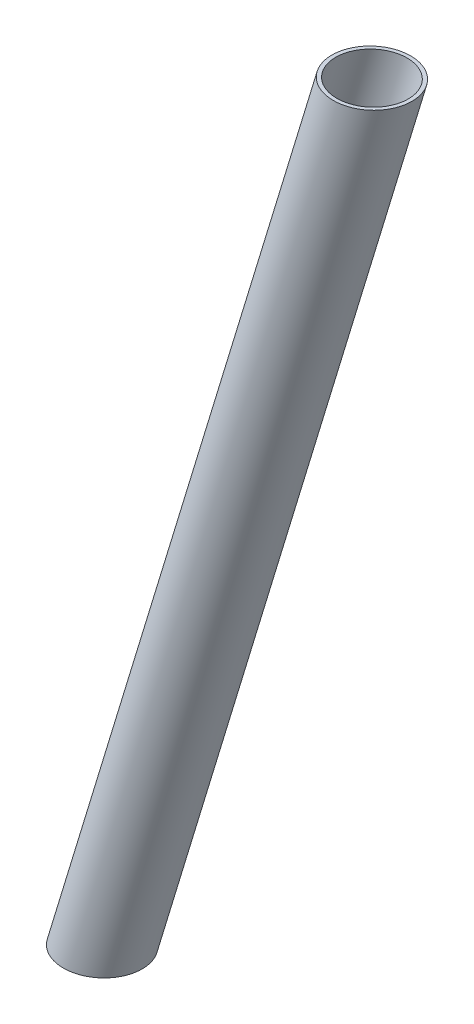
ISO-10303-21;
HEADER;
FILE_DESCRIPTION(('STEP AP214'),'2;1');
FILE_NAME('part.step','',(''),(''),'','','');
FILE_SCHEMA(('AUTOMOTIVE_DESIGN { 1 0 10303 214 1 1 1 1 }'));
ENDSEC;
DATA;
#1=APPLICATION_CONTEXT('core data for automotive mechanical design processes');
#2=APPLICATION_PROTOCOL_DEFINITION('international standard','automotive_design',2000,#1);
#3=PRODUCT_CONTEXT('',#1,'mechanical');
#4=PRODUCT('Part','Part','',(#3));
#5=PRODUCT_RELATED_PRODUCT_CATEGORY('part','',(#4));
#6=PRODUCT_DEFINITION_FORMATION('','',#4);
#7=PRODUCT_DEFINITION_CONTEXT('part definition',#1,'design');
#8=PRODUCT_DEFINITION('design','',#6,#7);
#9=PRODUCT_DEFINITION_SHAPE('','',#8);
#10=(LENGTH_UNIT() NAMED_UNIT(*) SI_UNIT(.MILLI.,.METRE.));
#11=(NAMED_UNIT(*) PLANE_ANGLE_UNIT() SI_UNIT($,.RADIAN.));
#12=(NAMED_UNIT(*) SI_UNIT($,.STERADIAN.) SOLID_ANGLE_UNIT());
#13=UNCERTAINTY_MEASURE_WITH_UNIT(LENGTH_MEASURE(1.E-05),#10,'distance_accuracy_value','');
#14=(GEOMETRIC_REPRESENTATION_CONTEXT(3) GLOBAL_UNCERTAINTY_ASSIGNED_CONTEXT((#13)) GLOBAL_UNIT_ASSIGNED_CONTEXT((#10,
#11,#12)) REPRESENTATION_CONTEXT('',''));
#15=CARTESIAN_POINT('',(0.,0.,0.));
#16=DIRECTION('',(0.,0.,1.));
#17=DIRECTION('',(1.,0.,0.));
#18=AXIS2_PLACEMENT_3D('',#15,#16,#17);
#19=CARTESIAN_POINT('',(7.988329,0.,0.));
#20=DIRECTION('',(0.,1.,0.));
#21=DIRECTION('',(0.,0.,1.));
#22=AXIS2_PLACEMENT_3D('',#19,#20,#21);
#23=PLANE('',#22);
#24=CARTESIAN_POINT('',(7.988329,0.,0.));
#25=DIRECTION('',(0.,1.,0.));
#26=DIRECTION('',(-1.,0.,0.));
#27=AXIS2_PLACEMENT_3D('',#24,#25,#26);
#28=ELLIPSE('',#27,8.,7.72);
#29=CARTESIAN_POINT('',(-0.0116709999999978,0.,0.));
#30=VERTEX_POINT('',#29);
#31=EDGE_CURVE('E11',#30,#30,#28,.T.);
#32=ORIENTED_EDGE('',*,*,#31,.F.);
#33=EDGE_LOOP('',(#32));
#34=FACE_BOUND('',#33,.T.);
#35=CARTESIAN_POINT('',(0.755207153882394,0.,0.0120596784166669));
#36=CARTESIAN_POINT('',(0.7555256312997,0.,0.20397937292244));
#37=CARTESIAN_POINT('',(0.764007149789612,0.,0.395863697663354));
#38=CARTESIAN_POINT('',(0.797221808332363,0.,0.778284051572364));
#39=CARTESIAN_POINT('',(0.821959355103936,0.,0.968819700978407));
#40=CARTESIAN_POINT('',(0.887510384326129,0.,1.34727740379534));
#41=CARTESIAN_POINT('',(0.928338293170894,0.,1.53519695467641));
#42=CARTESIAN_POINT('',(1.02574098246932,0.,1.90698347045138));
#43=CARTESIAN_POINT('',(1.0823216087023,0.,2.09084890348728));
#44=CARTESIAN_POINT('',(1.21065049783151,0.,2.45288505703585));
#45=CARTESIAN_POINT('',(1.28237517245868,0.,2.63106414340688));
#46=CARTESIAN_POINT('',(1.44048583351206,0.,2.98087023738001));
#47=CARTESIAN_POINT('',(1.52687720700094,0.,3.1524948090409));
#48=CARTESIAN_POINT('',(1.71355520760588,0.,3.48787744354628));
#49=CARTESIAN_POINT('',(1.81383366077904,0.,3.65164005813768));
#50=CARTESIAN_POINT('',(2.02758000326452,0.,3.97040314430617));
#51=CARTESIAN_POINT('',(2.14105282258593,0.,4.1254003083566));
#52=CARTESIAN_POINT('',(2.38196369665353,0.,4.42768499397216));
#53=CARTESIAN_POINT('',(2.50957437418934,0.,4.57483492590374));
#54=CARTESIAN_POINT('',(2.77651572869798,0.,4.85818550697875));
#55=CARTESIAN_POINT('',(2.91585067949947,0.,4.99438212763871));
#56=CARTESIAN_POINT('',(3.205139798675,0.,5.25491306583361));
#57=CARTESIAN_POINT('',(3.35509153532152,0.,5.37925008454178));
#58=CARTESIAN_POINT('',(3.66462583687721,0.,5.61541399444382));
#59=CARTESIAN_POINT('',(3.82421199881232,0.,5.72723616817881));
#60=CARTESIAN_POINT('',(4.15679739484265,0.,5.94085875832422));
#61=CARTESIAN_POINT('',(4.33005590317878,0.,6.04225564599698));
#62=CARTESIAN_POINT('',(4.68438639629524,0.,6.23049245246492));
#63=CARTESIAN_POINT('',(4.86546129704479,0.,6.31732687855908));
#64=CARTESIAN_POINT('',(5.23408940004271,0.,6.47590009796413));
#65=CARTESIAN_POINT('',(5.42164220658292,0.,6.54763981145592));
#66=CARTESIAN_POINT('',(5.80195922658219,0.,6.67563853536326));
#67=CARTESIAN_POINT('',(5.99472356958751,0.,6.73189716056689));
#68=CARTESIAN_POINT('',(6.3899281060024,0.,6.83006021634739));
#69=CARTESIAN_POINT('',(6.59248592136504,0.,6.87149159129227));
#70=CARTESIAN_POINT('',(7.00025383826591,0.,6.93737865776443));
#71=CARTESIAN_POINT('',(7.20546279483648,0.,6.96184144341388));
#72=CARTESIAN_POINT('',(7.61730459393639,0.,6.99369378017856));
#73=CARTESIAN_POINT('',(7.82393809531113,0.,7.00107481374277));
#74=CARTESIAN_POINT('',(8.23703017096557,0.,6.99869919793363));
#75=CARTESIAN_POINT('',(8.44348878155139,0.,6.98894879325747));
#76=CARTESIAN_POINT('',(8.85822613328444,0.,6.9520791277149));
#77=CARTESIAN_POINT('',(9.06648014554075,0.,6.92468093820488));
#78=CARTESIAN_POINT('',(9.47985848661278,0.,6.85242381628751));
#79=CARTESIAN_POINT('',(9.68498393388007,0.,6.80757128337449));
#80=CARTESIAN_POINT('',(10.0907870954186,0.,6.70064215324442));
#81=CARTESIAN_POINT('',(10.2914629653866,0.,6.63855855290087));
#82=CARTESIAN_POINT('',(10.6867293058887,0.,6.49756812357686));
#83=CARTESIAN_POINT('',(10.8813221385617,0.,6.41866792018592));
#84=CARTESIAN_POINT('',(11.2621740688192,0.,6.24490361073299));
#85=CARTESIAN_POINT('',(11.4484671580642,0.,6.15011403256319));
#86=CARTESIAN_POINT('',(11.8121680956754,0.,5.94494606189031));
#87=CARTESIAN_POINT('',(11.9895794724473,0.,5.83457392746034));
#88=CARTESIAN_POINT('',(12.3342624928436,0.,5.59887549405114));
#89=CARTESIAN_POINT('',(12.5015308525987,0.,5.47354439057754));
#90=CARTESIAN_POINT('',(12.8244471449908,0.,5.20883552510083));
#91=CARTESIAN_POINT('',(12.9800999275697,0.,5.06946368340809));
#92=CARTESIAN_POINT('',(13.2750235071229,0.,4.78104437360544));
#93=CARTESIAN_POINT('',(13.4145951039271,0.,4.632304457099));
#94=CARTESIAN_POINT('',(13.6803005834816,0.,4.32336656928526));
#95=CARTESIAN_POINT('',(13.8064397795303,0.,4.16317317072338));
#96=CARTESIAN_POINT('',(14.0442799397268,0.,3.83238930691991));
#97=CARTESIAN_POINT('',(14.1559802370348,0.,3.66179836201765));
#98=CARTESIAN_POINT('',(14.3639599138652,0.,3.31146065052711));
#99=CARTESIAN_POINT('',(14.4602396784615,0.,3.13171411271556));
#100=CARTESIAN_POINT('',(14.6336655939008,0.,2.77034757614217));
#101=CARTESIAN_POINT('',(14.7113296777991,0.,2.58897599935017));
#102=CARTESIAN_POINT('',(14.8507439104657,0.,2.22021777992886));
#103=CARTESIAN_POINT('',(14.9124945403791,0.,2.03283131935296));
#104=CARTESIAN_POINT('',(15.0195347806086,0.,1.65343960711848));
#105=CARTESIAN_POINT('',(15.0648265418566,0.,1.46143496248781));
#106=CARTESIAN_POINT('',(15.1385563396876,0.,1.07421631181628));
#107=CARTESIAN_POINT('',(15.1669946236914,0.,0.879002352933637));
#108=CARTESIAN_POINT('',(15.2062505657458,0.,0.491887065225879));
#109=CARTESIAN_POINT('',(15.2175025840886,0.,0.300029660788434));
#110=CARTESIAN_POINT('',(15.2236713449264,0.,-0.084014441967027));
#111=CARTESIAN_POINT('',(15.2185825360441,0.,-0.276201230018577));
#112=CARTESIAN_POINT('',(15.1921062098874,0.,-0.659365282867995));
#113=CARTESIAN_POINT('',(15.1707256509873,0.,-0.850343028956277));
#114=CARTESIAN_POINT('',(15.1118459550985,0.,-1.2298691625468));
#115=CARTESIAN_POINT('',(15.0743408641972,0.,-1.41841662616446));
#116=CARTESIAN_POINT('',(14.9838804036464,0.,-1.79022458430914));
#117=CARTESIAN_POINT('',(14.9310464268368,0.,-1.97351463952805));
#118=CARTESIAN_POINT('',(14.8102347314405,0.,-2.33510634825003));
#119=CARTESIAN_POINT('',(14.7422515144146,0.,-2.51340616402334));
#120=CARTESIAN_POINT('',(14.5917303456759,0.,-2.86367688841697));
#121=CARTESIAN_POINT('',(14.5091974169399,0.,-3.03564995652619));
#122=CARTESIAN_POINT('',(14.3301838604037,0.,-3.37225528221532));
#123=CARTESIAN_POINT('',(14.2336980298332,0.,-3.53688477142016));
#124=CARTESIAN_POINT('',(14.0261975153444,0.,-3.8597779313026));
#125=CARTESIAN_POINT('',(13.9150089112816,0.,-4.01792982408503));
#126=CARTESIAN_POINT('',(13.6799277510007,0.,-4.32457867123584));
#127=CARTESIAN_POINT('',(13.5560305518141,0.,-4.47307206435122));
#128=CARTESIAN_POINT('',(13.2965352056952,0.,-4.75937912144384));
#129=CARTESIAN_POINT('',(13.1609402285742,0.,-4.89719565949476));
#130=CARTESIAN_POINT('',(12.8789616684313,0.,-5.16141382929224));
#131=CARTESIAN_POINT('',(12.7325740661591,0.,-5.28781116905366));
#132=CARTESIAN_POINT('',(12.4258874802239,0.,-5.53174485804931));
#133=CARTESIAN_POINT('',(12.2653149672658,0.,-5.64893738744341));
#134=CARTESIAN_POINT('',(11.9350311090982,0.,-5.86977045328311));
#135=CARTESIAN_POINT('',(11.7653165849368,0.,-5.97340623212895));
#136=CARTESIAN_POINT('',(11.4180094054938,0.,-6.16647951030249));
#137=CARTESIAN_POINT('',(11.2404171750484,0.,-6.25591777409888));
#138=CARTESIAN_POINT('',(10.8785670122149,0.,-6.42010729276175));
#139=CARTESIAN_POINT('',(10.6943088899685,0.,-6.49485812890937));
#140=CARTESIAN_POINT('',(10.3145203636936,0.,-6.6313681730892));
#141=CARTESIAN_POINT('',(10.1188176416349,0.,-6.69264830705555));
#142=CARTESIAN_POINT('',(9.72307896161591,0.,-6.79879505217082));
#143=CARTESIAN_POINT('',(9.52304435614704,0.,-6.84366671025985));
#144=CARTESIAN_POINT('',(9.11986712340145,0.,-6.91679406747401));
#145=CARTESIAN_POINT('',(8.91672312259687,0.,-6.94504219255041));
#146=CARTESIAN_POINT('',(8.50887350705751,0.,-6.98473063349155));
#147=CARTESIAN_POINT('',(8.3041684619439,0.,-6.99617681060679));
#148=CARTESIAN_POINT('',(7.8901063211091,0.,-7.0022833918687));
#149=CARTESIAN_POINT('',(7.68074373813919,0.,-6.99657799877494));
#150=CARTESIAN_POINT('',(7.26331093179351,0.,-6.96762207210909));
#151=CARTESIAN_POINT('',(7.05524027552619,0.,-6.94437777528178));
#152=CARTESIAN_POINT('',(6.64169889683973,0.,-6.88046941352247));
#153=CARTESIAN_POINT('',(6.43622932189401,0.,-6.83979791856954));
#154=CARTESIAN_POINT('',(6.02952972110908,0.,-6.74128563800089));
#155=CARTESIAN_POINT('',(5.8282981029036,0.,-6.68345142896099));
#156=CARTESIAN_POINT('',(5.43102392607119,0.,-6.55080070469891));
#157=CARTESIAN_POINT('',(5.23499356164779,0.,-6.47594764784231));
#158=CARTESIAN_POINT('',(4.85011145780346,0.,-6.30981009498024));
#159=CARTESIAN_POINT('',(4.66125694545141,0.,-6.21853202585869));
#160=CARTESIAN_POINT('',(4.29202791702596,0.,-6.02005530861101));
#161=CARTESIAN_POINT('',(4.11165605525404,0.,-5.9128517203079));
#162=CARTESIAN_POINT('',(3.76094143575391,0.,-5.68327248045909));
#163=CARTESIAN_POINT('',(3.5905945605452,0.,-5.56090312287841));
#164=CARTESIAN_POINT('',(3.26430496809214,0.,-5.30418538172361));
#165=CARTESIAN_POINT('',(3.10815265466531,0.,-5.17010339985061));
#166=CARTESIAN_POINT('',(2.80806621257723,0.,-4.88900586910927));
#167=CARTESIAN_POINT('',(2.66412731509242,0.,-4.74199541434937));
#168=CARTESIAN_POINT('',(2.38954826698956,0.,-4.43594683742597));
#169=CARTESIAN_POINT('',(2.25891252945973,0.,-4.27690475427917));
#170=CARTESIAN_POINT('',(2.01211663031951,0.,-3.94796310787735));
#171=CARTESIAN_POINT('',(1.89595584681933,0.,-3.77806401154872));
#172=CARTESIAN_POINT('',(1.68247423322475,0.,-3.43403643341301));
#173=CARTESIAN_POINT('',(1.584683085129,0.,-3.26019969450334));
#174=CARTESIAN_POINT('',(1.40449186439923,0.,-2.90472976831041));
#175=CARTESIAN_POINT('',(1.32209107015798,0.,-2.72309694705325));
#176=CARTESIAN_POINT('',(1.17349172784371,0.,-2.35358593202038));
#177=CARTESIAN_POINT('',(1.10727251980456,0.,-2.16571605345088));
#178=CARTESIAN_POINT('',(0.991507812873262,0.,-1.78497835399874));
#179=CARTESIAN_POINT('',(0.9419572121216,0.,-1.59211208189303));
#180=CARTESIAN_POINT('',(0.852191660774543,0.,-1.16592349772998));
#181=CARTESIAN_POINT('',(0.815513978410206,0.,-0.931847647292858));
#182=CARTESIAN_POINT('',(0.766825639676092,0.,-0.461143362217406));
#183=CARTESIAN_POINT('',(0.754814574667426,0.,-0.224514969930985));
#184=CARTESIAN_POINT('',(0.755207153882394,0.,0.0120596784166669));
#185=B_SPLINE_CURVE_WITH_KNOTS('',3,(#35,#36,#37,#38,#39,#40,#41,#42,#43,#44,#45,#46,#47,#48,
#49,#50,#51,#52,#53,#54,#55,#56,#57,#58,#59,#60,#61,#62,#63,#64,#65,#66,#67,#68,#69,#70,#71,#72,
#73,#74,#75,#76,#77,#78,#79,#80,#81,#82,#83,#84,#85,#86,#87,#88,#89,#90,#91,#92,#93,#94,#95,#96,
#97,#98,#99,#100,#101,#102,#103,#104,#105,#106,#107,#108,#109,#110,#111,#112,#113,#114,#115,
#116,#117,#118,#119,#120,#121,#122,#123,#124,#125,#126,#127,#128,#129,#130,#131,#132,#133,#134,
#135,#136,#137,#138,#139,#140,#141,#142,#143,#144,#145,#146,#147,#148,#149,#150,#151,#152,#153,
#154,#155,#156,#157,#158,#159,#160,#161,#162,#163,#164,#165,#166,#167,#168,#169,#170,#171,#172,
#173,#174,#175,#176,#177,#178,#179,#180,#181,#182,#183,#184),.UNSPECIFIED.,.T.,.F.,(4,2,2,2,2,2,
2,2,2,2,2,2,2,2,2,2,2,2,2,2,2,2,2,2,2,2,2,2,2,2,2,2,2,2,2,2,2,2,2,2,2,2,2,2,2,2,2,2,2,2,2,2,2,2,
2,2,2,2,2,2,2,2,2,2,2,2,2,2,2,2,2,2,2,2,4),(0.,0.57554924282631,1.15125457116313,
1.72747724746528,2.30391404369991,2.87945952330269,3.45521685931743,4.03063673333759,
4.60627230522374,5.18993212264848,5.77380563000255,6.35754583368556,6.94150534178827,
7.54306161004835,8.14484426677514,8.74659022790778,9.3483511607753,9.96788609618658,
10.5871618639243,11.2067463574577,11.8261050488818,12.4555014214593,13.0846672480165,
13.7140891583203,14.3432635389861,14.969565419671,15.5956164844966,16.2218691670923,
16.8478588852753,17.4590143585475,18.0699271790793,18.6808682036667,19.2917939697583,
19.8829695605322,20.4741272749431,21.0652077059315,21.656279459233,22.2321499356631,
22.8082160700238,23.3840362984204,23.9600693287581,24.5316596445951,25.1034577588686,
25.6750588572688,26.2468736470131,26.8261863630693,27.4057114846734,27.9850800594814,
28.5646654958474,29.1603560885419,29.7562551749599,30.3521221641531,30.9480061382502,
31.562514415498,32.176833522199,32.7914323099786,33.405816647967,34.0333964566727,
34.6607532063065,35.2883776937033,35.9157619917053,36.5445063024408,37.173005126935,
37.801699323656,38.4301334734704,39.0468309932067,39.6632865997692,40.2799460429392,
40.8965789833291,41.4942068445907,42.0918066778476,42.688639486936,43.2852894533002,
43.9947664865549,44.7042317661815),.UNSPECIFIED.);
#186=CARTESIAN_POINT('',(0.755207153882389,0.,0.0120596784166669));
#187=VERTEX_POINT('',#186);
#188=EDGE_CURVE('E57',#187,#187,#185,.T.);
#189=ORIENTED_EDGE('',*,*,#188,.T.);
#190=EDGE_LOOP('',(#189));
#191=FACE_BOUND('',#190,.T.);
#192=ADVANCED_FACE('F44',(#34,#191),#23,.F.);
#193=CARTESIAN_POINT('',(61.8630840022327,176.98,0.));
#194=DIRECTION('',(0.,1.,0.));
#195=DIRECTION('',(0.,0.,1.));
#196=AXIS2_PLACEMENT_3D('',#193,#194,#195);
#197=PLANE('',#196);
#198=CARTESIAN_POINT('',(61.8630840022327,176.98,0.));
#199=DIRECTION('',(0.,1.,0.));
#200=DIRECTION('',(-1.,0.,0.));
#201=AXIS2_PLACEMENT_3D('',#198,#199,#200);
#202=ELLIPSE('',#201,8.,7.72);
#203=CARTESIAN_POINT('',(53.8630840022327,176.98,0.));
#204=VERTEX_POINT('',#203);
#205=EDGE_CURVE('E52',#204,#204,#202,.T.);
#206=ORIENTED_EDGE('',*,*,#205,.T.);
#207=EDGE_LOOP('',(#206));
#208=FACE_BOUND('',#207,.T.);
#209=CARTESIAN_POINT('',(54.6299621561153,176.98,0.0120596784166669));
#210=CARTESIAN_POINT('',(54.6302797858412,176.98,0.201171197056495));
#211=CARTESIAN_POINT('',(54.6385205583944,176.98,0.390326802730939));
#212=CARTESIAN_POINT('',(54.6708106928233,176.98,0.767498832955749));
#213=CARTESIAN_POINT('',(54.694880499947,176.98,0.955513466394931));
#214=CARTESIAN_POINT('',(54.7589913489986,176.98,1.33090102185468));
#215=CARTESIAN_POINT('',(54.7992022309538,176.98,1.51824503519617));
#216=CARTESIAN_POINT('',(54.8952709422358,176.98,1.8889506820121));
#217=CARTESIAN_POINT('',(54.9511348679169,176.98,2.07231073382082));
#218=CARTESIAN_POINT('',(55.0780941175349,176.98,2.43385806529548));
#219=CARTESIAN_POINT('',(55.1492027024188,176.98,2.6120406870237));
#220=CARTESIAN_POINT('',(55.3060701073451,176.98,2.96191297322045));
#221=CARTESIAN_POINT('',(55.3918344162651,176.98,3.13360017548541));
#222=CARTESIAN_POINT('',(55.5776110805979,176.98,3.46981447336245));
#223=CARTESIAN_POINT('',(55.6776690492227,176.98,3.63431635639981));
#224=CARTESIAN_POINT('',(55.8910729313238,176.98,3.95454487870103));
#225=CARTESIAN_POINT('',(56.0044236658913,176.98,4.11026830363854));
#226=CARTESIAN_POINT('',(56.2434470017359,176.98,4.41180200165982));
#227=CARTESIAN_POINT('',(56.3691124566131,176.98,4.5576179419629));
#228=CARTESIAN_POINT('',(56.631934061149,176.98,4.83859413593427));
#229=CARTESIAN_POINT('',(56.7690945026764,176.98,4.97375037271438));
#230=CARTESIAN_POINT('',(57.0575564180105,176.98,5.23589065484496));
#231=CARTESIAN_POINT('',(57.2091315735394,176.98,5.3625735863831));
#232=CARTESIAN_POINT('',(57.5222302180424,176.98,5.60310140289846));
#233=CARTESIAN_POINT('',(57.6837573660885,176.98,5.7169415218501));
#234=CARTESIAN_POINT('',(58.015523969721,176.98,5.9310488271924));
#235=CARTESIAN_POINT('',(58.1857617894852,176.98,6.03131854924024));
#236=CARTESIAN_POINT('',(58.5338582211053,176.98,6.2177807149701));
#237=CARTESIAN_POINT('',(58.7117197067932,176.98,6.30396779005909));
#238=CARTESIAN_POINT('',(59.0794403799004,176.98,6.4642060685932));
#239=CARTESIAN_POINT('',(59.2695006939478,176.98,6.53779596745079));
#240=CARTESIAN_POINT('',(59.6551286747,176.98,6.66907196739729));
#241=CARTESIAN_POINT('',(59.850698801208,176.98,6.72675083706673));
#242=CARTESIAN_POINT('',(60.245894257118,176.98,6.82583773301697));
#243=CARTESIAN_POINT('',(60.4455191355113,176.98,6.86724755858748));
#244=CARTESIAN_POINT('',(60.8474902249082,176.98,6.93358159757392));
#245=CARTESIAN_POINT('',(61.0498364818582,176.98,6.95850553229245));
#246=CARTESIAN_POINT('',(61.4608155673607,176.98,6.99213644697481));
#247=CARTESIAN_POINT('',(61.669481872014,176.98,7.00043560277612));
#248=CARTESIAN_POINT('',(62.0867020890186,176.98,6.99955178008899));
#249=CARTESIAN_POINT('',(62.2952560150032,176.98,6.99037499136181));
#250=CARTESIAN_POINT('',(62.7109572913416,176.98,6.95459556683954));
#251=CARTESIAN_POINT('',(62.918103983448,176.98,6.92798527664162));
#252=CARTESIAN_POINT('',(63.3293584716703,176.98,6.8574948468683));
#253=CARTESIAN_POINT('',(63.5334673811245,176.98,6.81362120451169));
#254=CARTESIAN_POINT('',(63.9385761633079,176.98,6.70851526706608));
#255=CARTESIAN_POINT('',(64.1395474611679,176.98,6.64717274578859));
#256=CARTESIAN_POINT('',(64.5354675047792,176.98,6.50763477733432));
#257=CARTESIAN_POINT('',(64.7304185303198,176.98,6.42944580140616));
#258=CARTESIAN_POINT('',(65.1129886492456,176.98,6.25664045115159));
#259=CARTESIAN_POINT('',(65.3006050217821,176.98,6.16201805024101));
#260=CARTESIAN_POINT('',(65.6669131515184,176.98,5.95699408877856));
#261=CARTESIAN_POINT('',(65.8456085221335,176.98,5.84659898802789));
#262=CARTESIAN_POINT('',(66.1901769986161,176.98,5.61245302612991));
#263=CARTESIAN_POINT('',(66.3562005138494,176.98,5.48892352893936));
#264=CARTESIAN_POINT('',(66.6769172298336,176.98,5.22805399449258));
#265=CARTESIAN_POINT('',(66.8316148093395,176.98,5.0907193437416));
#266=CARTESIAN_POINT('',(67.128497326021,176.98,4.80310729473359));
#267=CARTESIAN_POINT('',(67.2706813643434,176.98,4.65282896825835));
#268=CARTESIAN_POINT('',(67.5413232299199,176.98,4.34038104211117));
#269=CARTESIAN_POINT('',(67.6697814046464,176.98,4.17821174363634));
#270=CARTESIAN_POINT('',(67.9082329398227,176.98,3.84816161664277));
#271=CARTESIAN_POINT('',(68.0186636245552,176.98,3.6805966427907));
#272=CARTESIAN_POINT('',(68.2246247668476,176.98,3.33654722215624));
#273=CARTESIAN_POINT('',(68.3201556618982,176.98,3.16006303746299));
#274=CARTESIAN_POINT('',(68.4954780340386,176.98,2.79947174748534));
#275=CARTESIAN_POINT('',(68.575271795894,176.98,2.61536575346145));
#276=CARTESIAN_POINT('',(68.7184274518668,176.98,2.24087177310662));
#277=CARTESIAN_POINT('',(68.7817896950546,176.98,2.050483920324));
#278=CARTESIAN_POINT('',(68.889816465267,176.98,1.67081994199292));
#279=CARTESIAN_POINT('',(68.9349973257065,176.98,1.48169058100094));
#280=CARTESIAN_POINT('',(69.0089965818952,176.98,1.10025963838624));
#281=CARTESIAN_POINT('',(69.0378154312486,176.98,0.907958144856717));
#282=CARTESIAN_POINT('',(69.0788372773005,176.98,0.521610627589563));
#283=CARTESIAN_POINT('',(69.0910419602893,176.98,0.327564782911293));
#284=CARTESIAN_POINT('',(69.0987330818339,176.98,-0.060857834727116));
#285=CARTESIAN_POINT('',(69.0942196389431,176.98,-0.255234605330786));
#286=CARTESIAN_POINT('',(69.0687429166793,176.98,-0.639438183369768));
#287=CARTESIAN_POINT('',(69.0480729981642,176.98,-0.829284518293299));
#288=CARTESIAN_POINT('',(68.9908069824239,176.98,-1.20662577690924));
#289=CARTESIAN_POINT('',(68.9542054725848,176.98,-1.39411987915961));
#290=CARTESIAN_POINT('',(68.8653991074398,176.98,-1.76529829900234));
#291=CARTESIAN_POINT('',(68.8132001879428,176.98,-1.94898403753257));
#292=CARTESIAN_POINT('',(68.6936039400688,176.98,-2.31141279307177));
#293=CARTESIAN_POINT('',(68.6262009644144,176.98,-2.49015394573705));
#294=CARTESIAN_POINT('',(68.4765505911209,176.98,-2.84188923332295));
#295=CARTESIAN_POINT('',(68.3942628394687,176.98,-3.01486619287531));
#296=CARTESIAN_POINT('',(68.215595634745,176.98,-3.35345983267657));
#297=CARTESIAN_POINT('',(68.1192110498381,176.98,-3.51907380373762));
#298=CARTESIAN_POINT('',(67.9131590972476,176.98,-3.84174692120269));
#299=CARTESIAN_POINT('',(67.803495786976,176.98,-3.99880865964587));
#300=CARTESIAN_POINT('',(67.5716569249097,176.98,-4.30349631804081));
#301=CARTESIAN_POINT('',(67.449476698227,176.98,-4.45111867884282));
#302=CARTESIAN_POINT('',(67.1907895453697,176.98,-4.73902571933231));
#303=CARTESIAN_POINT('',(67.0540310670253,176.98,-4.87908439147915));
#304=CARTESIAN_POINT('',(66.7694141099075,176.98,-5.14753093630715));
#305=CARTESIAN_POINT('',(66.6215515721942,176.98,-5.27591450302347));
#306=CARTESIAN_POINT('',(66.3158607406237,176.98,-5.52017848460815));
#307=CARTESIAN_POINT('',(66.1580332984567,176.98,-5.63605996573009));
#308=CARTESIAN_POINT('',(65.8335115750261,176.98,-5.85466975638846));
#309=CARTESIAN_POINT('',(65.6668168380502,176.98,-5.95739738898968));
#310=CARTESIAN_POINT('',(65.3203833033655,176.98,-6.15211588437301));
#311=CARTESIAN_POINT('',(65.1403997543605,176.98,-6.24367147536779));
#312=CARTESIAN_POINT('',(64.7735069578759,176.98,-6.41165461370209));
#313=CARTESIAN_POINT('',(64.5865975743497,176.98,-6.48808186368299));
#314=CARTESIAN_POINT('',(64.2071281548102,176.98,-6.6253897402479));
#315=CARTESIAN_POINT('',(64.0145674131403,176.98,-6.6862684160727));
#316=CARTESIAN_POINT('',(63.6251293540016,176.98,-6.79213490574737));
#317=CARTESIAN_POINT('',(63.4282520304183,176.98,-6.83712269708641));
#318=CARTESIAN_POINT('',(63.0259553709712,176.98,-6.9119983614164));
#319=CARTESIAN_POINT('',(62.8204509751198,176.98,-6.94142984937892));
#320=CARTESIAN_POINT('',(62.4077779572812,176.98,-6.98307746539348));
#321=CARTESIAN_POINT('',(62.200609922929,176.98,-6.99529942459823));
#322=CARTESIAN_POINT('',(61.785880831406,176.98,-7.00248182714477));
#323=CARTESIAN_POINT('',(61.5783196391364,176.98,-6.99743448442452));
#324=CARTESIAN_POINT('',(61.1644127023279,176.98,-6.97009448737714));
#325=CARTESIAN_POINT('',(60.9580665415712,176.98,-6.94780813201819));
#326=CARTESIAN_POINT('',(60.545326334363,176.98,-6.88572710345695));
#327=CARTESIAN_POINT('',(60.338965312995,176.98,-6.84571252512923));
#328=CARTESIAN_POINT('',(59.9304457502184,176.98,-6.7483779037181));
#329=CARTESIAN_POINT('',(59.72828567231,176.98,-6.69106431123054));
#330=CARTESIAN_POINT('',(59.3294841024492,176.98,-6.55943518307957));
#331=CARTESIAN_POINT('',(59.1328448950043,176.98,-6.48511272233593));
#332=CARTESIAN_POINT('',(58.7467156953468,176.98,-6.31995727876001));
#333=CARTESIAN_POINT('',(58.557222880986,176.98,-6.22913089763006));
#334=CARTESIAN_POINT('',(58.1883079082266,176.98,-6.03233795870022));
#335=CARTESIAN_POINT('',(58.0088145940214,176.98,-5.92650482479542));
#336=CARTESIAN_POINT('',(57.6596533462711,176.98,-5.69984052862592));
#337=CARTESIAN_POINT('',(57.4899816955401,176.98,-5.57901509561675));
#338=CARTESIAN_POINT('',(57.1617442035946,176.98,-5.32311981624715));
#339=CARTESIAN_POINT('',(57.0031781250637,176.98,-5.18805027442533));
#340=CARTESIAN_POINT('',(56.6984528735643,176.98,-4.90457306679318));
#341=CARTESIAN_POINT('',(56.5522933755801,176.98,-4.75616575060275));
#342=CARTESIAN_POINT('',(56.2773584034112,176.98,-4.45119504336051));
#343=CARTESIAN_POINT('',(56.1482218484826,176.98,-4.2949571081991));
#344=CARTESIAN_POINT('',(55.9039434642994,176.98,-3.97189941872266));
#345=CARTESIAN_POINT('',(55.7888012233653,176.98,-3.80507997591023));
#346=CARTESIAN_POINT('',(55.5734412953597,176.98,-3.46195482951989));
#347=CARTESIAN_POINT('',(55.4732308334205,176.98,-3.28564458937628));
#348=CARTESIAN_POINT('',(55.2886877434346,176.98,-2.92490882578206));
#349=CARTESIAN_POINT('',(55.2043541460626,176.98,-2.74048379860973));
#350=CARTESIAN_POINT('',(55.0546946093797,176.98,-2.37076859434101));
#351=CARTESIAN_POINT('',(54.988857420605,176.98,-2.18568521061135));
#352=CARTESIAN_POINT('',(54.873364260456,176.98,-1.81054232850629));
#353=CARTESIAN_POINT('',(54.8237073181621,176.98,-1.62048312945175));
#354=CARTESIAN_POINT('',(54.7411061639222,176.98,-1.23725114700638));
#355=CARTESIAN_POINT('',(54.708122262965,176.98,-1.04408689785603));
#356=CARTESIAN_POINT('',(54.6589974460064,176.98,-0.655712981733382));
#357=CARTESIAN_POINT('',(54.6428462510908,176.98,-0.460504636645955));
#358=CARTESIAN_POINT('',(54.6315428654479,176.98,-0.17270858146684));
#359=CARTESIAN_POINT('',(54.6298069798615,176.98,-0.08032971277751));
#360=CARTESIAN_POINT('',(54.6299621561153,176.98,0.0120596784166669));
#361=B_SPLINE_CURVE_WITH_KNOTS('',3,(#209,#210,#211,#212,#213,#214,#215,#216,#217,#218,#219,
#220,#221,#222,#223,#224,#225,#226,#227,#228,#229,#230,#231,#232,#233,#234,#235,#236,#237,#238,
#239,#240,#241,#242,#243,#244,#245,#246,#247,#248,#249,#250,#251,#252,#253,#254,#255,#256,#257,
#258,#259,#260,#261,#262,#263,#264,#265,#266,#267,#268,#269,#270,#271,#272,#273,#274,#275,#276,
#277,#278,#279,#280,#281,#282,#283,#284,#285,#286,#287,#288,#289,#290,#291,#292,#293,#294,#295,
#296,#297,#298,#299,#300,#301,#302,#303,#304,#305,#306,#307,#308,#309,#310,#311,#312,#313,#314,
#315,#316,#317,#318,#319,#320,#321,#322,#323,#324,#325,#326,#327,#328,#329,#330,#331,#332,#333,
#334,#335,#336,#337,#338,#339,#340,#341,#342,#343,#344,#345,#346,#347,#348,#349,#350,#351,#352,
#353,#354,#355,#356,#357,#358,#359,#360),.UNSPECIFIED.,.T.,.F.,(4,2,2,2,2,2,2,2,2,2,2,2,2,2,2,2,
2,2,2,2,2,2,2,2,2,2,2,2,2,2,2,2,2,2,2,2,2,2,2,2,2,2,2,2,2,2,2,2,2,2,2,2,2,2,2,2,2,2,2,2,2,2,2,2,
2,2,2,2,2,2,2,2,2,2,2,4),(0.,0.567268881443085,1.13527190698369,1.70941518061457,
2.28378237603843,2.85865124117248,3.43373588058929,4.01069849095483,4.58787100815285,
5.16471054569828,5.74176642488012,6.33372199719036,6.92589652922682,7.51796025899142,
8.11024917160254,8.72097580116296,9.33197954486749,9.94291569502254,10.5538621729162,
11.1796208134911,11.8051578593927,12.4309697396033,13.056546314787,13.686161142084,
14.3155345445163,14.9451392445638,15.574486821585,16.1945383151137,16.8143488086928,
17.4342037872523,18.0540430703688,18.6553451791609,19.2566296290796,19.8578267183075,
20.4590110346942,21.0416564513865,21.6242857146008,22.2068558381995,22.7894218306172,
23.3616488814796,23.934070493225,24.506274538889,25.0786914706044,25.6526841936439,
26.2268863965069,26.800913588335,27.3751559581037,27.9617449147988,28.5485493447982,
29.1353036889335,29.7220882170241,30.3271901874508,30.9323040504197,31.537493795087,
32.142684397055,32.7647625096901,33.3866297910975,34.008777485412,34.6306979603079,
35.2605588252473,35.8901851121426,36.5200682059092,37.1496998937635,37.7740488072811,
38.3981598586083,39.0222575691645,39.6463389251659,40.2536840169461,40.8610112377527,
41.468631382023,42.0762144174103,42.6648274123637,43.2534050802132,43.8405750031544,
44.4273861595341,44.7045222482128),.UNSPECIFIED.);
#362=CARTESIAN_POINT('',(54.6299621561153,176.98,0.0120596784166669));
#363=VERTEX_POINT('',#362);
#364=EDGE_CURVE('E125',#363,#363,#361,.T.);
#365=ORIENTED_EDGE('',*,*,#364,.F.);
#366=EDGE_LOOP('',(#365));
#367=FACE_BOUND('',#366,.T.);
#368=ADVANCED_FACE('F77',(#208,#367),#197,.T.);
#369=CARTESIAN_POINT('',(53.8630840022327,176.98,0.));
#370=CARTESIAN_POINT('',(-0.0116709999999978,0.,0.));
#371=CARTESIAN_POINT('',(53.8630840022327,176.98,-15.44));
#372=CARTESIAN_POINT('',(-0.011670999999998,0.,-15.44));
#373=CARTESIAN_POINT('',(69.8630840022327,176.98,-15.44));
#374=CARTESIAN_POINT('',(15.988329,0.,-15.44));
#375=CARTESIAN_POINT('',(69.8630840022327,176.98,0.));
#376=CARTESIAN_POINT('',(15.988329,0.,0.));
#377=CARTESIAN_POINT('',(69.8630840022327,176.98,15.44));
#378=CARTESIAN_POINT('',(15.988329,0.,15.44));
#379=CARTESIAN_POINT('',(53.8630840022327,176.98,15.44));
#380=CARTESIAN_POINT('',(-0.0116709999999976,0.,15.44));
#381=CARTESIAN_POINT('',(53.8630840022327,176.98,0.));
#382=CARTESIAN_POINT('',(-0.0116709999999978,0.,0.));
#383=(BOUNDED_SURFACE() B_SPLINE_SURFACE(3,1,((#369,#370),(#371,#372),(#373,#374),(#375,#376),
(#377,#378),(#379,#380),(#381,#382)),.UNSPECIFIED.,.T.,.F.,.F.) B_SPLINE_SURFACE_WITH_KNOTS((4,
3,4),(2,2),(0.,0.5,1.),(0.,1.),
.UNSPECIFIED.) GEOMETRIC_REPRESENTATION_ITEM() RATIONAL_B_SPLINE_SURFACE(((1.,1.),
(0.333333333333333,0.333333333333333),(0.333333333333333,0.333333333333333),(1.,1.),
(0.333333333333333,0.333333333333333),(0.333333333333333,0.333333333333333),(1.,1.))) REPRESENTATION_ITEM('') SURFACE());
#384=ORIENTED_EDGE('',*,*,#205,.F.);
#385=EDGE_LOOP('',(#384));
#386=FACE_BOUND('',#385,.T.);
#387=ORIENTED_EDGE('',*,*,#31,.T.);
#388=EDGE_LOOP('',(#387));
#389=FACE_BOUND('',#388,.T.);
#390=ADVANCED_FACE('F86',(#386,#389),#383,.T.);
#391=CARTESIAN_POINT('',(55.1687097061378,178.749800000001,0.0120596784166669));
#392=CARTESIAN_POINT('',(0.211072128360093,-1.78749799999917,0.0120596784166669));
#393=CARTESIAN_POINT('',(55.1920517016724,178.749800000001,14.0120596784167));
#394=CARTESIAN_POINT('',(0.234414123894702,-1.78749799999914,14.0120596784167));
#395=CARTESIAN_POINT('',(69.658295393903,178.749800000001,13.9879403215833));
#396=CARTESIAN_POINT('',(14.7006578161253,-1.78749799999914,13.9879403215833));
#397=CARTESIAN_POINT('',(69.6349533983684,178.749800000001,-0.0120596784166628));
#398=CARTESIAN_POINT('',(14.6773158205907,-1.78749799999917,-0.0120596784166628));
#399=CARTESIAN_POINT('',(69.6116114028338,178.749800000001,-14.0120596784167));
#400=CARTESIAN_POINT('',(14.6539738250561,-1.78749799999914,-14.0120596784167));
#401=CARTESIAN_POINT('',(55.1453677106032,178.749800000001,-13.9879403215833));
#402=CARTESIAN_POINT('',(0.187730132825484,-1.78749799999914,-13.9879403215833));
#403=CARTESIAN_POINT('',(55.1687097061378,178.749800000001,0.0120596784166669));
#404=CARTESIAN_POINT('',(0.211072128360093,-1.78749799999917,0.0120596784166669));
#405=(BOUNDED_SURFACE() B_SPLINE_SURFACE(3,1,((#391,#392),(#393,#394),(#395,#396),(#397,#398),
(#399,#400),(#401,#402),(#403,#404)),.UNSPECIFIED.,.T.,.F.,.F.) B_SPLINE_SURFACE_WITH_KNOTS((4,
3,4),(2,2),(0.,0.5,1.),(0.,1.),
.UNSPECIFIED.) GEOMETRIC_REPRESENTATION_ITEM() RATIONAL_B_SPLINE_SURFACE(((1.,1.),
(0.333333333333333,0.333333333333333),(0.333333333333333,0.333333333333333),(1.,1.),
(0.333333333333333,0.333333333333333),(0.333333333333333,0.333333333333333),(1.,1.))) REPRESENTATION_ITEM('') SURFACE());
#406=CARTESIAN_POINT('',(0.755207153882389,0.,0.0120596784166669));
#407=CARTESIAN_POINT('',(1.31640251848898,1.84354166666666,0.0120596784166669));
#408=CARTESIAN_POINT('',(1.87759788309557,3.68708333333332,0.0120596784166669));
#409=CARTESIAN_POINT('',(2.99998861230876,7.37416666666666,0.0120596784166669));
#410=CARTESIAN_POINT('',(3.56118397691535,9.21770833333333,0.0120596784166669));
#411=CARTESIAN_POINT('',(4.68357470612854,12.9047916666667,0.0120596784166669));
#412=CARTESIAN_POINT('',(5.24477007073513,14.7483333333333,0.0120596784166669));
#413=CARTESIAN_POINT('',(6.36716079994832,18.4354166666667,0.0120596784166669));
#414=CARTESIAN_POINT('',(6.92835616455491,20.2789583333333,0.0120596784166669));
#415=CARTESIAN_POINT('',(8.0507468937681,23.9660416666667,0.0120596784166669));
#416=CARTESIAN_POINT('',(8.61194225837469,25.8095833333333,0.0120596784166669));
#417=CARTESIAN_POINT('',(9.73433298758787,29.4966666666667,0.0120596784166669));
#418=CARTESIAN_POINT('',(10.2955283521945,31.3402083333333,0.0120596784166669));
#419=CARTESIAN_POINT('',(11.4179190814077,35.0272916666667,0.0120596784166669));
#420=CARTESIAN_POINT('',(11.9791144460142,36.8708333333333,0.0120596784166669));
#421=CARTESIAN_POINT('',(13.1015051752274,40.5579166666667,0.0120596784166669));
#422=CARTESIAN_POINT('',(13.662700539834,42.4014583333333,0.0120596784166669));
#423=CARTESIAN_POINT('',(14.7850912690472,46.0885416666667,0.0120596784166669));
#424=CARTESIAN_POINT('',(15.3462866336538,47.9320833333333,0.0120596784166669));
#425=CARTESIAN_POINT('',(16.468677362867,51.6191666666667,0.0120596784166669));
#426=CARTESIAN_POINT('',(17.0298727274736,53.4627083333333,0.0120596784166669));
#427=CARTESIAN_POINT('',(18.1522634566868,57.1497916666667,0.0120596784166669));
#428=CARTESIAN_POINT('',(18.7134588212934,58.9933333333333,0.0120596784166669));
#429=CARTESIAN_POINT('',(19.8358495505065,62.6804166666667,0.0120596784166669));
#430=CARTESIAN_POINT('',(20.3970449151131,64.5239583333333,0.0120596784166669));
#431=CARTESIAN_POINT('',(21.5194356443263,68.2110416666667,0.0120596784166669));
#432=CARTESIAN_POINT('',(22.0806310089329,70.0545833333333,0.0120596784166669));
#433=CARTESIAN_POINT('',(23.2030217381461,73.7416666666667,0.0120596784166669));
#434=CARTESIAN_POINT('',(23.7642171027527,75.5852083333333,0.0120596784166669));
#435=CARTESIAN_POINT('',(24.8866078319659,79.2722916666666,0.0120596784166669));
#436=CARTESIAN_POINT('',(25.4478031965725,81.1158333333333,0.0120596784166669));
#437=CARTESIAN_POINT('',(26.5701939257857,84.8029166666666,0.0120596784166669));
#438=CARTESIAN_POINT('',(27.1313892903922,86.6464583333333,0.0120596784166669));
#439=CARTESIAN_POINT('',(28.2537800196054,90.3335416666667,0.0120596784166669));
#440=CARTESIAN_POINT('',(28.814975384212,92.1770833333333,0.0120596784166669));
#441=CARTESIAN_POINT('',(29.9373661134252,95.8641666666667,0.0120596784166669));
#442=CARTESIAN_POINT('',(30.4985614780318,97.7077083333333,0.0120596784166669));
#443=CARTESIAN_POINT('',(31.620952207245,101.394791666667,0.0120596784166669));
#444=CARTESIAN_POINT('',(32.1821475718516,103.238333333333,0.0120596784166669));
#445=CARTESIAN_POINT('',(33.3045383010648,106.925416666667,0.0120596784166669));
#446=CARTESIAN_POINT('',(33.8657336656714,108.768958333333,0.0120596784166669));
#447=CARTESIAN_POINT('',(34.9881243948846,112.456041666667,0.0120596784166669));
#448=CARTESIAN_POINT('',(35.5493197594911,114.299583333333,0.0120596784166669));
#449=CARTESIAN_POINT('',(36.6717104887043,117.986666666667,0.0120596784166669));
#450=CARTESIAN_POINT('',(37.2329058533109,119.830208333333,0.0120596784166669));
#451=CARTESIAN_POINT('',(38.3552965825241,123.517291666667,0.0120596784166669));
#452=CARTESIAN_POINT('',(38.9164919471307,125.360833333333,0.0120596784166669));
#453=CARTESIAN_POINT('',(40.0388826763439,129.047916666667,0.0120596784166669));
#454=CARTESIAN_POINT('',(40.6000780409505,130.891458333333,0.0120596784166669));
#455=CARTESIAN_POINT('',(41.7224687701637,134.578541666667,0.0120596784166669));
#456=CARTESIAN_POINT('',(42.2836641347703,136.422083333333,0.0120596784166669));
#457=CARTESIAN_POINT('',(43.4060548639834,140.109166666667,0.0120596784166669));
#458=CARTESIAN_POINT('',(43.96725022859,141.952708333333,0.0120596784166669));
#459=CARTESIAN_POINT('',(45.0896409578032,145.639791666667,0.0120596784166669));
#460=CARTESIAN_POINT('',(45.6508363224098,147.483333333333,0.0120596784166669));
#461=CARTESIAN_POINT('',(46.773227051623,151.170416666667,0.0120596784166669));
#462=CARTESIAN_POINT('',(47.3344224162296,153.013958333333,0.0120596784166669));
#463=CARTESIAN_POINT('',(48.4568131454428,156.701041666667,0.0120596784166669));
#464=CARTESIAN_POINT('',(49.0180085100494,158.544583333333,0.0120596784166669));
#465=CARTESIAN_POINT('',(50.1403992392626,162.231666666667,0.0120596784166669));
#466=CARTESIAN_POINT('',(50.7015946038692,164.075208333333,0.0120596784166669));
#467=CARTESIAN_POINT('',(51.8239853330823,167.762291666667,0.0120596784166669));
#468=CARTESIAN_POINT('',(52.3851806976889,169.605833333333,0.0120596784166669));
#469=CARTESIAN_POINT('',(53.5075714269021,173.292916666667,0.0120596784166669));
#470=CARTESIAN_POINT('',(54.0687667915087,175.136458333333,0.0120596784166669));
#471=CARTESIAN_POINT('',(54.6299621561153,176.98,0.0120596784166669));
#472=B_SPLINE_CURVE_WITH_KNOTS('',3,(#406,#407,#408,#409,#410,#411,#412,#413,#414,#415,#416,
#417,#418,#419,#420,#421,#422,#423,#424,#425,#426,#427,#428,#429,#430,#431,#432,#433,#434,#435,
#436,#437,#438,#439,#440,#441,#442,#443,#444,#445,#446,#447,#448,#449,#450,#451,#452,#453,#454,
#455,#456,#457,#458,#459,#460,#461,#462,#463,#464,#465,#466,#467,#468,#469,#470,#471),
.UNSPECIFIED.,.F.,.F.,(4,2,2,2,2,2,2,2,2,2,2,2,2,2,2,2,2,2,2,2,2,2,2,2,2,2,2,2,2,2,2,2,4),(0.,
5.78120013716255,11.5624002743251,17.3436004114877,23.1248005486502,28.9060006858128,
34.6872008229753,40.4684009601379,46.2496010973004,52.030801234463,57.8120013716255,
63.5932015087881,69.3744016459506,75.1556017831132,80.9368019202757,86.7180020574383,
92.4992021946009,98.2804023317634,104.061602468926,109.842802606089,115.624002743251,
121.405202880414,127.186403017576,132.967603154739,138.748803291901,144.530003429064,
150.311203566226,156.092403703389,161.873603840552,167.654803977714,173.436004114877,
179.217204252039,184.998404389202),.UNSPECIFIED.);
#473=EDGE_CURVE('BSEAM94',#187,#363,#472,.T.);
#474=ORIENTED_EDGE('',*,*,#188,.F.);
#475=ORIENTED_EDGE('',*,*,#364,.T.);
#476=ORIENTED_EDGE('',*,*,#473,.T.);
#477=ORIENTED_EDGE('',*,*,#473,.F.);
#478=EDGE_LOOP('',(#474,#476,#475,#477));
#479=FACE_BOUND('',#478,.T.);
#480=ADVANCED_FACE('F94',(#479),#405,.T.);
#481=CLOSED_SHELL('',(#192,#368,#390,#480));
#482=MANIFOLD_SOLID_BREP('B2',#481);
#483=ADVANCED_BREP_SHAPE_REPRESENTATION('',(#18,#482),#14);
#484=SHAPE_DEFINITION_REPRESENTATION(#9,#483);
ENDSEC;
END-ISO-10303-21;
